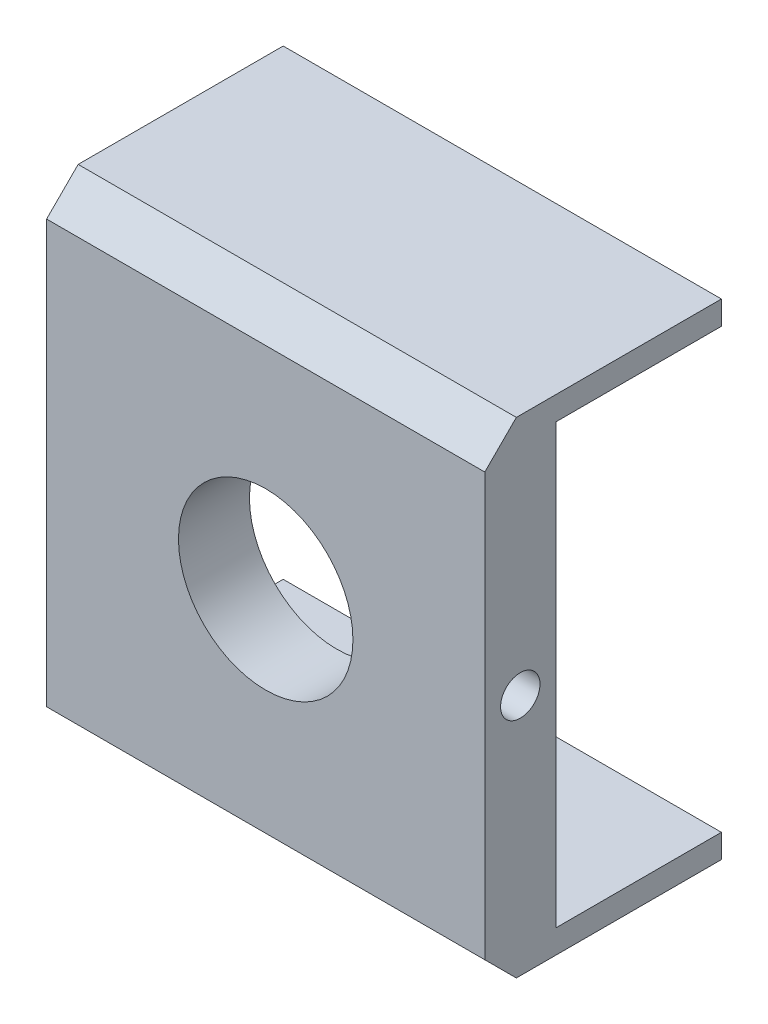
ISO-10303-21;
HEADER;
FILE_DESCRIPTION(('STEP AP214'),'2;1');
FILE_NAME('part.step','',(''),(''),'','','');
FILE_SCHEMA(('AUTOMOTIVE_DESIGN { 1 0 10303 214 1 1 1 1 }'));
ENDSEC;
DATA;
#1=APPLICATION_CONTEXT('core data for automotive mechanical design processes');
#2=APPLICATION_PROTOCOL_DEFINITION('international standard','automotive_design',2000,#1);
#3=PRODUCT_CONTEXT('',#1,'mechanical');
#4=PRODUCT('Part','Part','',(#3));
#5=PRODUCT_RELATED_PRODUCT_CATEGORY('part','',(#4));
#6=PRODUCT_DEFINITION_FORMATION('','',#4);
#7=PRODUCT_DEFINITION_CONTEXT('part definition',#1,'design');
#8=PRODUCT_DEFINITION('design','',#6,#7);
#9=PRODUCT_DEFINITION_SHAPE('','',#8);
#10=(LENGTH_UNIT() NAMED_UNIT(*) SI_UNIT(.MILLI.,.METRE.));
#11=(NAMED_UNIT(*) PLANE_ANGLE_UNIT() SI_UNIT($,.RADIAN.));
#12=(NAMED_UNIT(*) SI_UNIT($,.STERADIAN.) SOLID_ANGLE_UNIT());
#13=UNCERTAINTY_MEASURE_WITH_UNIT(LENGTH_MEASURE(1.E-05),#10,'distance_accuracy_value','');
#14=(GEOMETRIC_REPRESENTATION_CONTEXT(3) GLOBAL_UNCERTAINTY_ASSIGNED_CONTEXT((#13)) GLOBAL_UNIT_ASSIGNED_CONTEXT((#10,
#11,#12)) REPRESENTATION_CONTEXT('',''));
#15=CARTESIAN_POINT('',(0.,0.,0.));
#16=DIRECTION('',(0.,0.,1.));
#17=DIRECTION('',(1.,0.,0.));
#18=AXIS2_PLACEMENT_3D('',#15,#16,#17);
#19=CARTESIAN_POINT('',(17.6403,19.5453,-9.525));
#20=DIRECTION('',(0.,0.,-1.));
#21=DIRECTION('',(-1.,0.,0.));
#22=AXIS2_PLACEMENT_3D('',#19,#20,#21);
#23=PLANE('',#22);
#24=DIRECTION('',(-1.,0.,0.));
#25=VECTOR('',#24,1.);
#26=CARTESIAN_POINT('',(17.6403,17.6403,-9.525));
#27=LINE('',#26,#25);
#28=CARTESIAN_POINT('',(17.6403,17.6403,-9.525));
#29=VERTEX_POINT('',#28);
#30=CARTESIAN_POINT('',(-17.6403,17.6403,-9.525));
#31=VERTEX_POINT('',#30);
#32=EDGE_CURVE('E157',#29,#31,#27,.T.);
#33=ORIENTED_EDGE('',*,*,#32,.T.);
#34=DIRECTION('',(0.,-1.,0.));
#35=VECTOR('',#34,1.);
#36=CARTESIAN_POINT('',(-17.6403,-19.5453,-9.525));
#37=LINE('',#36,#35);
#38=CARTESIAN_POINT('',(-17.6403,19.5453,-9.525));
#39=VERTEX_POINT('',#38);
#40=EDGE_CURVE('E185',#39,#31,#37,.T.);
#41=ORIENTED_EDGE('',*,*,#40,.F.);
#42=DIRECTION('',(-1.,0.,0.));
#43=VECTOR('',#42,1.);
#44=CARTESIAN_POINT('',(-17.6403,19.5453,-9.525));
#45=LINE('',#44,#43);
#46=CARTESIAN_POINT('',(17.6403,19.5453,-9.525));
#47=VERTEX_POINT('',#46);
#48=EDGE_CURVE('E181',#47,#39,#45,.T.);
#49=ORIENTED_EDGE('',*,*,#48,.F.);
#50=DIRECTION('',(0.,1.,0.));
#51=VECTOR('',#50,1.);
#52=CARTESIAN_POINT('',(17.6403,-19.5453,-9.525));
#53=LINE('',#52,#51);
#54=EDGE_CURVE('E169',#29,#47,#53,.T.);
#55=ORIENTED_EDGE('',*,*,#54,.F.);
#56=EDGE_LOOP('',(#33,#41,#49,#55));
#57=FACE_BOUND('',#56,.T.);
#58=ADVANCED_FACE('F37',(#57),#23,.T.);
#59=CARTESIAN_POINT('',(17.6403,-19.5453,9.525));
#60=DIRECTION('',(-1.,0.,0.));
#61=DIRECTION('',(0.,0.,1.));
#62=AXIS2_PLACEMENT_3D('',#59,#60,#61);
#63=PLANE('',#62);
#64=CARTESIAN_POINT('',(17.6403,0.,6.6675));
#65=DIRECTION('',(1.,0.,0.));
#66=DIRECTION('',(0.,0.,-1.));
#67=AXIS2_PLACEMENT_3D('',#64,#65,#66);
#68=CIRCLE('',#67,1.5875);
#69=CARTESIAN_POINT('',(17.6403,0.,5.08));
#70=VERTEX_POINT('',#69);
#71=EDGE_CURVE('E129',#70,#70,#68,.T.);
#72=ORIENTED_EDGE('',*,*,#71,.F.);
#73=EDGE_LOOP('',(#72));
#74=FACE_BOUND('',#73,.T.);
#75=DIRECTION('',(0.,1.,0.));
#76=VECTOR('',#75,1.);
#77=CARTESIAN_POINT('',(17.6403,-19.5453,9.525));
#78=LINE('',#77,#76);
#79=CARTESIAN_POINT('',(17.6403,-17.0053,9.525));
#80=VERTEX_POINT('',#79);
#81=CARTESIAN_POINT('',(17.6403,17.0053,9.525));
#82=VERTEX_POINT('',#81);
#83=EDGE_CURVE('E170',#80,#82,#78,.T.);
#84=ORIENTED_EDGE('',*,*,#83,.F.);
#85=DIRECTION('',(0.,0.707106781186546,0.707106781186549));
#86=VECTOR('',#85,1.);
#87=CARTESIAN_POINT('',(17.6403,-17.0053,9.525));
#88=LINE('',#87,#86);
#89=CARTESIAN_POINT('',(17.6403,-19.5453,6.98499999999999));
#90=VERTEX_POINT('',#89);
#91=EDGE_CURVE('E207',#80,#90,#88,.F.);
#92=ORIENTED_EDGE('',*,*,#91,.T.);
#93=DIRECTION('',(0.,0.,-1.));
#94=VECTOR('',#93,1.);
#95=CARTESIAN_POINT('',(17.6403,-19.5453,9.525));
#96=LINE('',#95,#94);
#97=CARTESIAN_POINT('',(17.6403,-19.5453,-9.525));
#98=VERTEX_POINT('',#97);
#99=EDGE_CURVE('E177',#90,#98,#96,.T.);
#100=ORIENTED_EDGE('',*,*,#99,.T.);
#101=CARTESIAN_POINT('',(17.6403,-17.6403,-9.525));
#102=VERTEX_POINT('',#101);
#103=EDGE_CURVE('E178',#98,#102,#53,.T.);
#104=ORIENTED_EDGE('',*,*,#103,.T.);
#105=DIRECTION('',(0.,0.,1.));
#106=VECTOR('',#105,1.);
#107=CARTESIAN_POINT('',(17.6403,-17.6403,3.81));
#108=LINE('',#107,#106);
#109=CARTESIAN_POINT('',(17.6403,-17.6403,3.81));
#110=VERTEX_POINT('',#109);
#111=EDGE_CURVE('E140',#102,#110,#108,.T.);
#112=ORIENTED_EDGE('',*,*,#111,.T.);
#113=DIRECTION('',(0.,1.,0.));
#114=VECTOR('',#113,1.);
#115=CARTESIAN_POINT('',(17.6403,17.6403,3.81));
#116=LINE('',#115,#114);
#117=CARTESIAN_POINT('',(17.6403,17.6403,3.81));
#118=VERTEX_POINT('',#117);
#119=EDGE_CURVE('E143',#110,#118,#116,.T.);
#120=ORIENTED_EDGE('',*,*,#119,.T.);
#121=DIRECTION('',(0.,0.,-1.));
#122=VECTOR('',#121,1.);
#123=CARTESIAN_POINT('',(17.6403,17.6403,-9.525));
#124=LINE('',#123,#122);
#125=EDGE_CURVE('E147',#118,#29,#124,.T.);
#126=ORIENTED_EDGE('',*,*,#125,.T.);
#127=ORIENTED_EDGE('',*,*,#54,.T.);
#128=DIRECTION('',(0.,0.,-1.));
#129=VECTOR('',#128,1.);
#130=CARTESIAN_POINT('',(17.6403,19.5453,9.525));
#131=LINE('',#130,#129);
#132=CARTESIAN_POINT('',(17.6403,19.5453,6.98499999999999));
#133=VERTEX_POINT('',#132);
#134=EDGE_CURVE('E195',#133,#47,#131,.T.);
#135=ORIENTED_EDGE('',*,*,#134,.F.);
#136=DIRECTION('',(0.,0.707106781186546,-0.707106781186549));
#137=VECTOR('',#136,1.);
#138=CARTESIAN_POINT('',(17.6403,17.0053,9.525));
#139=LINE('',#138,#137);
#140=EDGE_CURVE('E205',#133,#82,#139,.F.);
#141=ORIENTED_EDGE('',*,*,#140,.T.);
#142=EDGE_LOOP('',(#84,#92,#100,#104,#112,#120,#126,#127,#135,#141));
#143=FACE_BOUND('',#142,.T.);
#144=ADVANCED_FACE('F221',(#74,#143),#63,.F.);
#145=CARTESIAN_POINT('',(-17.6403,19.5453,9.525));
#146=DIRECTION('',(0.,-1.,0.));
#147=DIRECTION('',(0.,0.,-1.));
#148=AXIS2_PLACEMENT_3D('',#145,#146,#147);
#149=PLANE('',#148);
#150=DIRECTION('',(0.,0.,-1.));
#151=VECTOR('',#150,1.);
#152=CARTESIAN_POINT('',(-17.6403,19.5453,9.525));
#153=LINE('',#152,#151);
#154=CARTESIAN_POINT('',(-17.6403,19.5453,6.98499999999999));
#155=VERTEX_POINT('',#154);
#156=EDGE_CURVE('E193',#155,#39,#153,.T.);
#157=ORIENTED_EDGE('',*,*,#156,.F.);
#158=DIRECTION('',(1.,0.,0.));
#159=VECTOR('',#158,1.);
#160=CARTESIAN_POINT('',(-17.6403,19.5453,6.98499999999999));
#161=LINE('',#160,#159);
#162=EDGE_CURVE('E11',#155,#133,#161,.T.);
#163=ORIENTED_EDGE('',*,*,#162,.T.);
#164=ORIENTED_EDGE('',*,*,#134,.T.);
#165=ORIENTED_EDGE('',*,*,#48,.T.);
#166=EDGE_LOOP('',(#157,#163,#164,#165));
#167=FACE_BOUND('',#166,.T.);
#168=ADVANCED_FACE('F248',(#167),#149,.F.);
#169=CARTESIAN_POINT('',(-17.6403,-19.5453,9.525));
#170=DIRECTION('',(1.,0.,0.));
#171=DIRECTION('',(0.,0.,-1.));
#172=AXIS2_PLACEMENT_3D('',#169,#170,#171);
#173=PLANE('',#172);
#174=CARTESIAN_POINT('',(-17.6403,0.,6.6675));
#175=DIRECTION('',(-1.,0.,0.));
#176=DIRECTION('',(0.,0.,1.));
#177=AXIS2_PLACEMENT_3D('',#174,#175,#176);
#178=CIRCLE('',#177,1.5875);
#179=CARTESIAN_POINT('',(-17.6403,0.,8.255));
#180=VERTEX_POINT('',#179);
#181=EDGE_CURVE('E128',#180,#180,#178,.T.);
#182=ORIENTED_EDGE('',*,*,#181,.F.);
#183=EDGE_LOOP('',(#182));
#184=FACE_BOUND('',#183,.T.);
#185=DIRECTION('',(0.,0.,-1.));
#186=VECTOR('',#185,1.);
#187=CARTESIAN_POINT('',(-17.6403,-19.5453,9.525));
#188=LINE('',#187,#186);
#189=CARTESIAN_POINT('',(-17.6403,-19.5453,6.98499999999999));
#190=VERTEX_POINT('',#189);
#191=CARTESIAN_POINT('',(-17.6403,-19.5453,-9.525));
#192=VERTEX_POINT('',#191);
#193=EDGE_CURVE('E191',#190,#192,#188,.T.);
#194=ORIENTED_EDGE('',*,*,#193,.F.);
#195=DIRECTION('',(0.,-0.707106781186546,-0.707106781186549));
#196=VECTOR('',#195,1.);
#197=CARTESIAN_POINT('',(-17.6403,-17.0053,9.525));
#198=LINE('',#197,#196);
#199=CARTESIAN_POINT('',(-17.6403,-17.0053,9.525));
#200=VERTEX_POINT('',#199);
#201=EDGE_CURVE('E45',#190,#200,#198,.F.);
#202=ORIENTED_EDGE('',*,*,#201,.T.);
#203=DIRECTION('',(0.,-1.,0.));
#204=VECTOR('',#203,1.);
#205=CARTESIAN_POINT('',(-17.6403,-19.5453,9.525));
#206=LINE('',#205,#204);
#207=CARTESIAN_POINT('',(-17.6403,17.0053,9.525));
#208=VERTEX_POINT('',#207);
#209=EDGE_CURVE('E173',#208,#200,#206,.T.);
#210=ORIENTED_EDGE('',*,*,#209,.F.);
#211=DIRECTION('',(0.,-0.707106781186546,0.707106781186549));
#212=VECTOR('',#211,1.);
#213=CARTESIAN_POINT('',(-17.6403,17.0053,9.525));
#214=LINE('',#213,#212);
#215=EDGE_CURVE('E52',#208,#155,#214,.F.);
#216=ORIENTED_EDGE('',*,*,#215,.T.);
#217=ORIENTED_EDGE('',*,*,#156,.T.);
#218=ORIENTED_EDGE('',*,*,#40,.T.);
#219=DIRECTION('',(0.,0.,-1.));
#220=VECTOR('',#219,1.);
#221=CARTESIAN_POINT('',(-17.6403,17.6403,-9.525));
#222=LINE('',#221,#220);
#223=CARTESIAN_POINT('',(-17.6403,17.6403,3.81));
#224=VERTEX_POINT('',#223);
#225=EDGE_CURVE('E144',#224,#31,#222,.T.);
#226=ORIENTED_EDGE('',*,*,#225,.F.);
#227=DIRECTION('',(0.,1.,0.));
#228=VECTOR('',#227,1.);
#229=CARTESIAN_POINT('',(-17.6403,17.6403,3.81));
#230=LINE('',#229,#228);
#231=CARTESIAN_POINT('',(-17.6403,-17.6403,3.81));
#232=VERTEX_POINT('',#231);
#233=EDGE_CURVE('E153',#232,#224,#230,.T.);
#234=ORIENTED_EDGE('',*,*,#233,.F.);
#235=DIRECTION('',(0.,0.,1.));
#236=VECTOR('',#235,1.);
#237=CARTESIAN_POINT('',(-17.6403,-17.6403,3.81));
#238=LINE('',#237,#236);
#239=CARTESIAN_POINT('',(-17.6403,-17.6403,-9.525));
#240=VERTEX_POINT('',#239);
#241=EDGE_CURVE('E139',#240,#232,#238,.T.);
#242=ORIENTED_EDGE('',*,*,#241,.F.);
#243=EDGE_CURVE('E184',#240,#192,#37,.T.);
#244=ORIENTED_EDGE('',*,*,#243,.T.);
#245=EDGE_LOOP('',(#194,#202,#210,#216,#217,#218,#226,#234,#242,#244));
#246=FACE_BOUND('',#245,.T.);
#247=ADVANCED_FACE('F211',(#184,#246),#173,.F.);
#248=CARTESIAN_POINT('',(-17.6403,-19.5453,9.525));
#249=DIRECTION('',(0.,1.,0.));
#250=DIRECTION('',(0.,0.,1.));
#251=AXIS2_PLACEMENT_3D('',#248,#249,#250);
#252=PLANE('',#251);
#253=ORIENTED_EDGE('',*,*,#99,.F.);
#254=DIRECTION('',(-1.,0.,0.));
#255=VECTOR('',#254,1.);
#256=CARTESIAN_POINT('',(-17.6403,-19.5453,6.98499999999999));
#257=LINE('',#256,#255);
#258=EDGE_CURVE('E60',#90,#190,#257,.T.);
#259=ORIENTED_EDGE('',*,*,#258,.T.);
#260=ORIENTED_EDGE('',*,*,#193,.T.);
#261=DIRECTION('',(1.,0.,0.));
#262=VECTOR('',#261,1.);
#263=CARTESIAN_POINT('',(-17.6403,-19.5453,-9.525));
#264=LINE('',#263,#262);
#265=EDGE_CURVE('E174',#192,#98,#264,.T.);
#266=ORIENTED_EDGE('',*,*,#265,.T.);
#267=EDGE_LOOP('',(#253,#259,#260,#266));
#268=FACE_BOUND('',#267,.T.);
#269=ADVANCED_FACE('F222',(#268),#252,.F.);
#270=CARTESIAN_POINT('',(17.6403,19.5453,9.525));
#271=DIRECTION('',(0.,0.,-1.));
#272=DIRECTION('',(-1.,0.,0.));
#273=AXIS2_PLACEMENT_3D('',#270,#271,#272);
#274=PLANE('',#273);
#275=CARTESIAN_POINT('',(0.,0.,9.525));
#276=DIRECTION('',(0.,0.,1.));
#277=DIRECTION('',(1.,0.,0.));
#278=AXIS2_PLACEMENT_3D('',#275,#276,#277);
#279=CIRCLE('',#278,7.0231);
#280=CARTESIAN_POINT('',(7.0231,0.,9.525));
#281=VERTEX_POINT('',#280);
#282=EDGE_CURVE('E166',#281,#281,#279,.T.);
#283=ORIENTED_EDGE('',*,*,#282,.F.);
#284=EDGE_LOOP('',(#283));
#285=FACE_BOUND('',#284,.T.);
#286=ORIENTED_EDGE('',*,*,#209,.T.);
#287=DIRECTION('',(1.,0.,0.));
#288=VECTOR('',#287,1.);
#289=CARTESIAN_POINT('',(17.6403,-17.0053,9.525));
#290=LINE('',#289,#288);
#291=EDGE_CURVE('E202',#200,#80,#290,.T.);
#292=ORIENTED_EDGE('',*,*,#291,.T.);
#293=ORIENTED_EDGE('',*,*,#83,.T.);
#294=DIRECTION('',(-1.,0.,0.));
#295=VECTOR('',#294,1.);
#296=CARTESIAN_POINT('',(17.6403,17.0053,9.525));
#297=LINE('',#296,#295);
#298=EDGE_CURVE('E197',#82,#208,#297,.T.);
#299=ORIENTED_EDGE('',*,*,#298,.T.);
#300=EDGE_LOOP('',(#286,#292,#293,#299));
#301=FACE_BOUND('',#300,.T.);
#302=ADVANCED_FACE('F216',(#285,#301),#274,.F.);
#303=DIRECTION('',(-1.,0.,0.));
#304=VECTOR('',#303,1.);
#305=CARTESIAN_POINT('',(17.6403,-17.6403,-9.525));
#306=LINE('',#305,#304);
#307=EDGE_CURVE('E150',#102,#240,#306,.T.);
#308=ORIENTED_EDGE('',*,*,#307,.F.);
#309=ORIENTED_EDGE('',*,*,#103,.F.);
#310=ORIENTED_EDGE('',*,*,#265,.F.);
#311=ORIENTED_EDGE('',*,*,#243,.F.);
#312=EDGE_LOOP('',(#308,#309,#310,#311));
#313=FACE_BOUND('',#312,.T.);
#314=ADVANCED_FACE('F228',(#313),#23,.T.);
#315=CARTESIAN_POINT('',(0.,0.,-9.525));
#316=DIRECTION('',(0.,0.,1.));
#317=DIRECTION('',(1.,0.,0.));
#318=AXIS2_PLACEMENT_3D('',#315,#316,#317);
#319=CYLINDRICAL_SURFACE('',#318,7.0231);
#320=CARTESIAN_POINT('',(0.,0.,3.81));
#321=DIRECTION('',(0.,0.,1.));
#322=DIRECTION('',(0.,-1.,0.));
#323=AXIS2_PLACEMENT_3D('',#320,#321,#322);
#324=CIRCLE('',#323,7.0231);
#325=CARTESIAN_POINT('',(7.0231,0.,3.81));
#326=VERTEX_POINT('',#325);
#327=EDGE_CURVE('E160',#326,#326,#324,.F.);
#328=CARTESIAN_POINT('',(7.0231,0.,3.81));
#329=CARTESIAN_POINT('',(7.0231,0.,3.86953125));
#330=CARTESIAN_POINT('',(7.0231,0.,3.9290625));
#331=CARTESIAN_POINT('',(7.0231,0.,4.048125));
#332=CARTESIAN_POINT('',(7.0231,0.,4.10765625));
#333=CARTESIAN_POINT('',(7.0231,0.,4.22671875));
#334=CARTESIAN_POINT('',(7.0231,0.,4.28625));
#335=CARTESIAN_POINT('',(7.0231,0.,4.4053125));
#336=CARTESIAN_POINT('',(7.0231,0.,4.46484375));
#337=CARTESIAN_POINT('',(7.0231,0.,4.58390625));
#338=CARTESIAN_POINT('',(7.0231,0.,4.6434375));
#339=CARTESIAN_POINT('',(7.0231,0.,4.7625));
#340=CARTESIAN_POINT('',(7.0231,0.,4.82203125));
#341=CARTESIAN_POINT('',(7.0231,0.,4.94109375));
#342=CARTESIAN_POINT('',(7.0231,0.,5.000625));
#343=CARTESIAN_POINT('',(7.0231,0.,5.1196875));
#344=CARTESIAN_POINT('',(7.0231,0.,5.17921875));
#345=CARTESIAN_POINT('',(7.0231,0.,5.29828125));
#346=CARTESIAN_POINT('',(7.0231,0.,5.3578125));
#347=CARTESIAN_POINT('',(7.0231,0.,5.476875));
#348=CARTESIAN_POINT('',(7.0231,0.,5.53640625));
#349=CARTESIAN_POINT('',(7.0231,0.,5.65546875));
#350=CARTESIAN_POINT('',(7.0231,0.,5.715));
#351=CARTESIAN_POINT('',(7.0231,0.,5.8340625));
#352=CARTESIAN_POINT('',(7.0231,0.,5.89359375));
#353=CARTESIAN_POINT('',(7.0231,0.,6.01265625));
#354=CARTESIAN_POINT('',(7.0231,0.,6.0721875));
#355=CARTESIAN_POINT('',(7.0231,0.,6.19125));
#356=CARTESIAN_POINT('',(7.0231,0.,6.25078125));
#357=CARTESIAN_POINT('',(7.0231,0.,6.36984375));
#358=CARTESIAN_POINT('',(7.0231,0.,6.429375));
#359=CARTESIAN_POINT('',(7.0231,0.,6.5484375));
#360=CARTESIAN_POINT('',(7.0231,0.,6.60796875));
#361=CARTESIAN_POINT('',(7.0231,0.,6.72703125));
#362=CARTESIAN_POINT('',(7.0231,0.,6.7865625));
#363=CARTESIAN_POINT('',(7.0231,0.,6.905625));
#364=CARTESIAN_POINT('',(7.0231,0.,6.96515625));
#365=CARTESIAN_POINT('',(7.0231,0.,7.08421875));
#366=CARTESIAN_POINT('',(7.0231,0.,7.14375));
#367=CARTESIAN_POINT('',(7.0231,0.,7.2628125));
#368=CARTESIAN_POINT('',(7.0231,0.,7.32234375));
#369=CARTESIAN_POINT('',(7.0231,0.,7.44140625));
#370=CARTESIAN_POINT('',(7.0231,0.,7.5009375));
#371=CARTESIAN_POINT('',(7.0231,0.,7.62));
#372=CARTESIAN_POINT('',(7.0231,0.,7.67953125));
#373=CARTESIAN_POINT('',(7.0231,0.,7.79859375));
#374=CARTESIAN_POINT('',(7.0231,0.,7.858125));
#375=CARTESIAN_POINT('',(7.0231,0.,7.9771875));
#376=CARTESIAN_POINT('',(7.0231,0.,8.03671875));
#377=CARTESIAN_POINT('',(7.0231,0.,8.15578125));
#378=CARTESIAN_POINT('',(7.0231,0.,8.2153125));
#379=CARTESIAN_POINT('',(7.0231,0.,8.334375));
#380=CARTESIAN_POINT('',(7.0231,0.,8.39390625));
#381=CARTESIAN_POINT('',(7.0231,0.,8.51296875));
#382=CARTESIAN_POINT('',(7.0231,0.,8.5725));
#383=CARTESIAN_POINT('',(7.0231,0.,8.6915625));
#384=CARTESIAN_POINT('',(7.0231,0.,8.75109375));
#385=CARTESIAN_POINT('',(7.0231,0.,8.87015625));
#386=CARTESIAN_POINT('',(7.0231,0.,8.9296875));
#387=CARTESIAN_POINT('',(7.0231,0.,9.04875));
#388=CARTESIAN_POINT('',(7.0231,0.,9.10828125));
#389=CARTESIAN_POINT('',(7.0231,0.,9.22734375));
#390=CARTESIAN_POINT('',(7.0231,0.,9.286875));
#391=CARTESIAN_POINT('',(7.0231,0.,9.4059375));
#392=CARTESIAN_POINT('',(7.0231,0.,9.46546875));
#393=CARTESIAN_POINT('',(7.0231,0.,9.525));
#394=B_SPLINE_CURVE_WITH_KNOTS('',3,(#328,#329,#330,#331,#332,#333,#334,#335,#336,#337,#338,
#339,#340,#341,#342,#343,#344,#345,#346,#347,#348,#349,#350,#351,#352,#353,#354,#355,#356,#357,
#358,#359,#360,#361,#362,#363,#364,#365,#366,#367,#368,#369,#370,#371,#372,#373,#374,#375,#376,
#377,#378,#379,#380,#381,#382,#383,#384,#385,#386,#387,#388,#389,#390,#391,#392,#393),
.UNSPECIFIED.,.F.,.F.,(4,2,2,2,2,2,2,2,2,2,2,2,2,2,2,2,2,2,2,2,2,2,2,2,2,2,2,2,2,2,2,2,4),(0.,
0.178593750000001,0.3571875,0.535781250000001,0.714375,0.892968750000001,1.0715625,1.25015625,
1.42875,1.60734375,1.7859375,1.96453125,2.143125,2.32171875,2.5003125,2.67890625,2.8575,
3.03609375,3.2146875,3.39328125,3.571875,3.75046875,3.9290625,4.10765625,4.28625,4.46484375,
4.6434375,4.82203125,5.000625,5.17921875,5.3578125,5.53640625,5.715),.UNSPECIFIED.);
#395=EDGE_CURVE('BSEAM266',#326,#281,#394,.T.);
#396=ORIENTED_EDGE('',*,*,#327,.T.);
#397=ORIENTED_EDGE('',*,*,#282,.T.);
#398=ORIENTED_EDGE('',*,*,#395,.T.);
#399=ORIENTED_EDGE('',*,*,#395,.F.);
#400=EDGE_LOOP('',(#396,#398,#397,#399));
#401=FACE_BOUND('',#400,.T.);
#402=ADVANCED_FACE('F266',(#401),#319,.F.);
#403=CARTESIAN_POINT('',(17.6403,17.6403,3.81));
#404=DIRECTION('',(0.,0.,1.));
#405=DIRECTION('',(0.,-1.,0.));
#406=AXIS2_PLACEMENT_3D('',#403,#404,#405);
#407=PLANE('',#406);
#408=ORIENTED_EDGE('',*,*,#233,.T.);
#409=DIRECTION('',(-1.,0.,0.));
#410=VECTOR('',#409,1.);
#411=CARTESIAN_POINT('',(17.6403,17.6403,3.81));
#412=LINE('',#411,#410);
#413=EDGE_CURVE('E161',#118,#224,#412,.T.);
#414=ORIENTED_EDGE('',*,*,#413,.F.);
#415=ORIENTED_EDGE('',*,*,#119,.F.);
#416=DIRECTION('',(-1.,0.,0.));
#417=VECTOR('',#416,1.);
#418=CARTESIAN_POINT('',(17.6403,-17.6403,3.81));
#419=LINE('',#418,#417);
#420=EDGE_CURVE('E163',#110,#232,#419,.T.);
#421=ORIENTED_EDGE('',*,*,#420,.T.);
#422=EDGE_LOOP('',(#408,#414,#415,#421));
#423=FACE_BOUND('',#422,.T.);
#424=ORIENTED_EDGE('',*,*,#327,.F.);
#425=EDGE_LOOP('',(#424));
#426=FACE_BOUND('',#425,.T.);
#427=ADVANCED_FACE('F235',(#423,#426),#407,.F.);
#428=CARTESIAN_POINT('',(17.6403,17.6403,-9.525));
#429=DIRECTION('',(0.,1.,0.));
#430=DIRECTION('',(0.,0.,1.));
#431=AXIS2_PLACEMENT_3D('',#428,#429,#430);
#432=PLANE('',#431);
#433=ORIENTED_EDGE('',*,*,#225,.T.);
#434=ORIENTED_EDGE('',*,*,#32,.F.);
#435=ORIENTED_EDGE('',*,*,#125,.F.);
#436=ORIENTED_EDGE('',*,*,#413,.T.);
#437=EDGE_LOOP('',(#433,#434,#435,#436));
#438=FACE_BOUND('',#437,.T.);
#439=ADVANCED_FACE('F240',(#438),#432,.F.);
#440=CARTESIAN_POINT('',(17.6403,-17.6403,3.81));
#441=DIRECTION('',(0.,-1.,0.));
#442=DIRECTION('',(0.,0.,-1.));
#443=AXIS2_PLACEMENT_3D('',#440,#441,#442);
#444=PLANE('',#443);
#445=ORIENTED_EDGE('',*,*,#241,.T.);
#446=ORIENTED_EDGE('',*,*,#420,.F.);
#447=ORIENTED_EDGE('',*,*,#111,.F.);
#448=ORIENTED_EDGE('',*,*,#307,.T.);
#449=EDGE_LOOP('',(#445,#446,#447,#448));
#450=FACE_BOUND('',#449,.T.);
#451=ADVANCED_FACE('F231',(#450),#444,.F.);
#452=CARTESIAN_POINT('',(-11.2903,0.,6.6675));
#453=DIRECTION('',(-1.,0.,0.));
#454=DIRECTION('',(0.,0.,1.));
#455=AXIS2_PLACEMENT_3D('',#452,#453,#454);
#456=CONICAL_SURFACE('',#455,1.5875,1.02974425867665);
#457=CARTESIAN_POINT('',(-10.3364337672937,0.,6.6675));
#458=VERTEX_POINT('',#457);
#459=VERTEX_LOOP('',#458);
#460=FACE_BOUND('',#459,.T.);
#461=CARTESIAN_POINT('',(-11.2903,0.,6.6675));
#462=DIRECTION('',(-1.,0.,0.));
#463=DIRECTION('',(0.,0.,1.));
#464=AXIS2_PLACEMENT_3D('',#461,#462,#463);
#465=CIRCLE('',#464,1.5875);
#466=CARTESIAN_POINT('',(-11.2903,0.,8.255));
#467=VERTEX_POINT('',#466);
#468=EDGE_CURVE('E132',#467,#467,#465,.T.);
#469=ORIENTED_EDGE('',*,*,#468,.T.);
#470=EDGE_LOOP('',(#469));
#471=FACE_BOUND('',#470,.T.);
#472=ADVANCED_FACE('F281',(#460,#471),#456,.F.);
#473=CARTESIAN_POINT('',(-17.6403,0.,6.6675));
#474=DIRECTION('',(-1.,0.,0.));
#475=DIRECTION('',(0.,0.,1.));
#476=AXIS2_PLACEMENT_3D('',#473,#474,#475);
#477=CYLINDRICAL_SURFACE('',#476,1.5875);
#478=ORIENTED_EDGE('',*,*,#468,.F.);
#479=EDGE_LOOP('',(#478));
#480=FACE_BOUND('',#479,.T.);
#481=ORIENTED_EDGE('',*,*,#181,.T.);
#482=EDGE_LOOP('',(#481));
#483=FACE_BOUND('',#482,.T.);
#484=ADVANCED_FACE('F122',(#480,#483),#477,.F.);
#485=CARTESIAN_POINT('',(11.2903,0.,6.6675));
#486=DIRECTION('',(1.,0.,0.));
#487=DIRECTION('',(0.,0.,-1.));
#488=AXIS2_PLACEMENT_3D('',#485,#486,#487);
#489=CONICAL_SURFACE('',#488,1.5875,1.02974425867665);
#490=CARTESIAN_POINT('',(10.3364337672937,0.,6.6675));
#491=VERTEX_POINT('',#490);
#492=VERTEX_LOOP('',#491);
#493=FACE_BOUND('',#492,.T.);
#494=CARTESIAN_POINT('',(11.2903,0.,6.6675));
#495=DIRECTION('',(1.,0.,0.));
#496=DIRECTION('',(0.,0.,-1.));
#497=AXIS2_PLACEMENT_3D('',#494,#495,#496);
#498=CIRCLE('',#497,1.5875);
#499=CARTESIAN_POINT('',(11.2903,0.,5.08));
#500=VERTEX_POINT('',#499);
#501=EDGE_CURVE('E126',#500,#500,#498,.T.);
#502=ORIENTED_EDGE('',*,*,#501,.T.);
#503=EDGE_LOOP('',(#502));
#504=FACE_BOUND('',#503,.T.);
#505=ADVANCED_FACE('F118',(#493,#504),#489,.F.);
#506=CARTESIAN_POINT('',(17.6403,0.,6.6675));
#507=DIRECTION('',(1.,0.,0.));
#508=DIRECTION('',(0.,0.,-1.));
#509=AXIS2_PLACEMENT_3D('',#506,#507,#508);
#510=CYLINDRICAL_SURFACE('',#509,1.5875);
#511=ORIENTED_EDGE('',*,*,#501,.F.);
#512=EDGE_LOOP('',(#511));
#513=FACE_BOUND('',#512,.T.);
#514=ORIENTED_EDGE('',*,*,#71,.T.);
#515=EDGE_LOOP('',(#514));
#516=FACE_BOUND('',#515,.T.);
#517=ADVANCED_FACE('F121',(#513,#516),#510,.F.);
#518=CARTESIAN_POINT('',(17.6403,-17.0053,9.525));
#519=DIRECTION('',(0.,0.707106781186549,-0.707106781186546));
#520=DIRECTION('',(0.,0.707106781186546,0.707106781186549));
#521=AXIS2_PLACEMENT_3D('',#518,#519,#520);
#522=PLANE('',#521);
#523=ORIENTED_EDGE('',*,*,#201,.F.);
#524=ORIENTED_EDGE('',*,*,#258,.F.);
#525=ORIENTED_EDGE('',*,*,#91,.F.);
#526=ORIENTED_EDGE('',*,*,#291,.F.);
#527=EDGE_LOOP('',(#523,#524,#525,#526));
#528=FACE_BOUND('',#527,.T.);
#529=ADVANCED_FACE('F219',(#528),#522,.F.);
#530=CARTESIAN_POINT('',(17.6403,17.0053,9.525));
#531=DIRECTION('',(0.,-0.707106781186549,-0.707106781186546));
#532=DIRECTION('',(0.,0.707106781186546,-0.707106781186549));
#533=AXIS2_PLACEMENT_3D('',#530,#531,#532);
#534=PLANE('',#533);
#535=ORIENTED_EDGE('',*,*,#140,.F.);
#536=ORIENTED_EDGE('',*,*,#162,.F.);
#537=ORIENTED_EDGE('',*,*,#215,.F.);
#538=ORIENTED_EDGE('',*,*,#298,.F.);
#539=EDGE_LOOP('',(#535,#536,#537,#538));
#540=FACE_BOUND('',#539,.T.);
#541=ADVANCED_FACE('F39',(#540),#534,.F.);
#542=CLOSED_SHELL('',(#58,#144,#168,#247,#269,#302,#314,#402,#427,#439,#451,#472,#484,#505,#517,
#529,#541));
#543=MANIFOLD_SOLID_BREP('B2',#542);
#544=ADVANCED_BREP_SHAPE_REPRESENTATION('',(#18,#543),#14);
#545=SHAPE_DEFINITION_REPRESENTATION(#9,#544);
ENDSEC;
END-ISO-10303-21;
